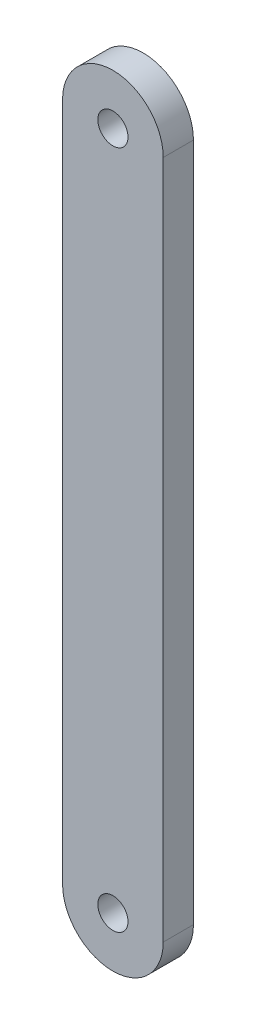
ISO-10303-21;
HEADER;
FILE_DESCRIPTION(('STEP AP214'),'2;1');
FILE_NAME('part.step','',(''),(''),'','','');
FILE_SCHEMA(('AUTOMOTIVE_DESIGN { 1 0 10303 214 1 1 1 1 }'));
ENDSEC;
DATA;
#1=APPLICATION_CONTEXT('core data for automotive mechanical design processes');
#2=APPLICATION_PROTOCOL_DEFINITION('international standard','automotive_design',2000,#1);
#3=PRODUCT_CONTEXT('',#1,'mechanical');
#4=PRODUCT('Part','Part','',(#3));
#5=PRODUCT_RELATED_PRODUCT_CATEGORY('part','',(#4));
#6=PRODUCT_DEFINITION_FORMATION('','',#4);
#7=PRODUCT_DEFINITION_CONTEXT('part definition',#1,'design');
#8=PRODUCT_DEFINITION('design','',#6,#7);
#9=PRODUCT_DEFINITION_SHAPE('','',#8);
#10=(LENGTH_UNIT() NAMED_UNIT(*) SI_UNIT(.MILLI.,.METRE.));
#11=(NAMED_UNIT(*) PLANE_ANGLE_UNIT() SI_UNIT($,.RADIAN.));
#12=(NAMED_UNIT(*) SI_UNIT($,.STERADIAN.) SOLID_ANGLE_UNIT());
#13=UNCERTAINTY_MEASURE_WITH_UNIT(LENGTH_MEASURE(1.E-05),#10,'distance_accuracy_value','');
#14=(GEOMETRIC_REPRESENTATION_CONTEXT(3) GLOBAL_UNCERTAINTY_ASSIGNED_CONTEXT((#13)) GLOBAL_UNIT_ASSIGNED_CONTEXT((#10,
#11,#12)) REPRESENTATION_CONTEXT('',''));
#15=CARTESIAN_POINT('',(0.,0.,0.));
#16=DIRECTION('',(0.,0.,1.));
#17=DIRECTION('',(1.,0.,0.));
#18=AXIS2_PLACEMENT_3D('',#15,#16,#17);
#19=CARTESIAN_POINT('',(5.,0.,3.));
#20=DIRECTION('',(1.,0.,0.));
#21=DIRECTION('',(0.,1.,0.));
#22=AXIS2_PLACEMENT_3D('',#19,#20,#21);
#23=PLANE('',#22);
#24=DIRECTION('',(0.,-1.,0.));
#25=VECTOR('',#24,1.);
#26=CARTESIAN_POINT('',(5.,0.,0.));
#27=LINE('',#26,#25);
#28=CARTESIAN_POINT('',(5.00000000000001,67.5,0.));
#29=VERTEX_POINT('',#28);
#30=CARTESIAN_POINT('',(5.,0.,0.));
#31=VERTEX_POINT('',#30);
#32=EDGE_CURVE('E120',#29,#31,#27,.T.);
#33=ORIENTED_EDGE('',*,*,#32,.F.);
#34=DIRECTION('',(0.,0.,-1.));
#35=VECTOR('',#34,1.);
#36=CARTESIAN_POINT('',(5.00000000000001,67.5,3.));
#37=LINE('',#36,#35);
#38=CARTESIAN_POINT('',(5.00000000000001,67.5,3.));
#39=VERTEX_POINT('',#38);
#40=EDGE_CURVE('E11',#39,#29,#37,.T.);
#41=ORIENTED_EDGE('',*,*,#40,.F.);
#42=DIRECTION('',(0.,-1.,0.));
#43=VECTOR('',#42,1.);
#44=CARTESIAN_POINT('',(5.,0.,3.));
#45=LINE('',#44,#43);
#46=CARTESIAN_POINT('',(5.,0.,3.));
#47=VERTEX_POINT('',#46);
#48=EDGE_CURVE('E93',#39,#47,#45,.T.);
#49=ORIENTED_EDGE('',*,*,#48,.T.);
#50=DIRECTION('',(0.,0.,-1.));
#51=VECTOR('',#50,1.);
#52=CARTESIAN_POINT('',(5.,0.,3.));
#53=LINE('',#52,#51);
#54=EDGE_CURVE('E82',#47,#31,#53,.T.);
#55=ORIENTED_EDGE('',*,*,#54,.T.);
#56=EDGE_LOOP('',(#33,#41,#49,#55));
#57=FACE_BOUND('',#56,.T.);
#58=ADVANCED_FACE('F43',(#57),#23,.T.);
#59=CARTESIAN_POINT('',(0.,67.5,3.));
#60=DIRECTION('',(0.,0.,-1.));
#61=DIRECTION('',(-1.,0.,0.));
#62=AXIS2_PLACEMENT_3D('',#59,#60,#61);
#63=CYLINDRICAL_SURFACE('',#62,5.);
#64=CARTESIAN_POINT('',(0.,67.5,0.));
#65=DIRECTION('',(0.,0.,1.));
#66=DIRECTION('',(1.,0.,0.));
#67=AXIS2_PLACEMENT_3D('',#64,#65,#66);
#68=CIRCLE('',#67,5.);
#69=CARTESIAN_POINT('',(-5.,67.5,0.));
#70=VERTEX_POINT('',#69);
#71=EDGE_CURVE('E100',#29,#70,#68,.T.);
#72=ORIENTED_EDGE('',*,*,#71,.T.);
#73=DIRECTION('',(0.,0.,-1.));
#74=VECTOR('',#73,1.);
#75=CARTESIAN_POINT('',(-5.,67.5,3.));
#76=LINE('',#75,#74);
#77=CARTESIAN_POINT('',(-5.,67.5,3.));
#78=VERTEX_POINT('',#77);
#79=EDGE_CURVE('E52',#78,#70,#76,.T.);
#80=ORIENTED_EDGE('',*,*,#79,.F.);
#81=CARTESIAN_POINT('',(0.,67.5,3.));
#82=DIRECTION('',(0.,0.,1.));
#83=DIRECTION('',(1.,0.,0.));
#84=AXIS2_PLACEMENT_3D('',#81,#82,#83);
#85=CIRCLE('',#84,5.);
#86=EDGE_CURVE('E87',#39,#78,#85,.T.);
#87=ORIENTED_EDGE('',*,*,#86,.F.);
#88=ORIENTED_EDGE('',*,*,#40,.T.);
#89=EDGE_LOOP('',(#72,#80,#87,#88));
#90=FACE_BOUND('',#89,.T.);
#91=ADVANCED_FACE('F98',(#90),#63,.T.);
#92=CARTESIAN_POINT('',(-5.,0.,3.));
#93=DIRECTION('',(-1.,0.,0.));
#94=DIRECTION('',(0.,-1.,0.));
#95=AXIS2_PLACEMENT_3D('',#92,#93,#94);
#96=PLANE('',#95);
#97=DIRECTION('',(0.,1.,0.));
#98=VECTOR('',#97,1.);
#99=CARTESIAN_POINT('',(-5.,0.,0.));
#100=LINE('',#99,#98);
#101=CARTESIAN_POINT('',(-5.,0.,0.));
#102=VERTEX_POINT('',#101);
#103=EDGE_CURVE('E126',#102,#70,#100,.T.);
#104=ORIENTED_EDGE('',*,*,#103,.F.);
#105=DIRECTION('',(0.,0.,-1.));
#106=VECTOR('',#105,1.);
#107=CARTESIAN_POINT('',(-5.,0.,3.));
#108=LINE('',#107,#106);
#109=CARTESIAN_POINT('',(-5.,0.,3.));
#110=VERTEX_POINT('',#109);
#111=EDGE_CURVE('E75',#110,#102,#108,.T.);
#112=ORIENTED_EDGE('',*,*,#111,.F.);
#113=DIRECTION('',(0.,1.,0.));
#114=VECTOR('',#113,1.);
#115=CARTESIAN_POINT('',(-5.,0.,3.));
#116=LINE('',#115,#114);
#117=EDGE_CURVE('E92',#110,#78,#116,.T.);
#118=ORIENTED_EDGE('',*,*,#117,.T.);
#119=ORIENTED_EDGE('',*,*,#79,.T.);
#120=EDGE_LOOP('',(#104,#112,#118,#119));
#121=FACE_BOUND('',#120,.T.);
#122=ADVANCED_FACE('F105',(#121),#96,.T.);
#123=CARTESIAN_POINT('',(0.,0.,3.));
#124=DIRECTION('',(0.,0.,-1.));
#125=DIRECTION('',(-1.,0.,0.));
#126=AXIS2_PLACEMENT_3D('',#123,#124,#125);
#127=CYLINDRICAL_SURFACE('',#126,1.5);
#128=CARTESIAN_POINT('',(0.,0.,3.));
#129=DIRECTION('',(0.,0.,1.));
#130=DIRECTION('',(1.,0.,0.));
#131=AXIS2_PLACEMENT_3D('',#128,#129,#130);
#132=CIRCLE('',#131,1.5);
#133=CARTESIAN_POINT('',(1.5,0.,3.));
#134=VERTEX_POINT('',#133);
#135=EDGE_CURVE('E109',#134,#134,#132,.T.);
#136=ORIENTED_EDGE('',*,*,#135,.T.);
#137=EDGE_LOOP('',(#136));
#138=FACE_BOUND('',#137,.T.);
#139=CARTESIAN_POINT('',(0.,0.,0.));
#140=DIRECTION('',(0.,0.,1.));
#141=DIRECTION('',(1.,0.,0.));
#142=AXIS2_PLACEMENT_3D('',#139,#140,#141);
#143=CIRCLE('',#142,1.5);
#144=CARTESIAN_POINT('',(1.5,0.,0.));
#145=VERTEX_POINT('',#144);
#146=EDGE_CURVE('E132',#145,#145,#143,.T.);
#147=ORIENTED_EDGE('',*,*,#146,.F.);
#148=EDGE_LOOP('',(#147));
#149=FACE_BOUND('',#148,.T.);
#150=ADVANCED_FACE('F153',(#138,#149),#127,.F.);
#151=CARTESIAN_POINT('',(0.,0.,3.));
#152=DIRECTION('',(0.,0.,-1.));
#153=DIRECTION('',(-1.,0.,0.));
#154=AXIS2_PLACEMENT_3D('',#151,#152,#153);
#155=CYLINDRICAL_SURFACE('',#154,5.);
#156=CARTESIAN_POINT('',(0.,0.,0.));
#157=DIRECTION('',(0.,0.,1.));
#158=DIRECTION('',(1.,0.,0.));
#159=AXIS2_PLACEMENT_3D('',#156,#157,#158);
#160=CIRCLE('',#159,5.);
#161=EDGE_CURVE('E129',#102,#31,#160,.T.);
#162=ORIENTED_EDGE('',*,*,#161,.T.);
#163=ORIENTED_EDGE('',*,*,#54,.F.);
#164=CARTESIAN_POINT('',(0.,0.,3.));
#165=DIRECTION('',(0.,0.,1.));
#166=DIRECTION('',(1.,0.,0.));
#167=AXIS2_PLACEMENT_3D('',#164,#165,#166);
#168=CIRCLE('',#167,5.);
#169=EDGE_CURVE('E60',#110,#47,#168,.T.);
#170=ORIENTED_EDGE('',*,*,#169,.F.);
#171=ORIENTED_EDGE('',*,*,#111,.T.);
#172=EDGE_LOOP('',(#162,#163,#170,#171));
#173=FACE_BOUND('',#172,.T.);
#174=ADVANCED_FACE('F156',(#173),#155,.T.);
#175=CARTESIAN_POINT('',(0.,67.5,3.));
#176=DIRECTION('',(0.,0.,-1.));
#177=DIRECTION('',(-1.,0.,0.));
#178=AXIS2_PLACEMENT_3D('',#175,#176,#177);
#179=CYLINDRICAL_SURFACE('',#178,1.5);
#180=CARTESIAN_POINT('',(0.,67.5,3.));
#181=DIRECTION('',(0.,0.,1.));
#182=DIRECTION('',(1.,0.,0.));
#183=AXIS2_PLACEMENT_3D('',#180,#181,#182);
#184=CIRCLE('',#183,1.5);
#185=CARTESIAN_POINT('',(1.5,67.5,3.));
#186=VERTEX_POINT('',#185);
#187=EDGE_CURVE('E116',#186,#186,#184,.T.);
#188=ORIENTED_EDGE('',*,*,#187,.T.);
#189=EDGE_LOOP('',(#188));
#190=FACE_BOUND('',#189,.T.);
#191=CARTESIAN_POINT('',(0.,67.5,0.));
#192=DIRECTION('',(0.,0.,1.));
#193=DIRECTION('',(1.,0.,0.));
#194=AXIS2_PLACEMENT_3D('',#191,#192,#193);
#195=CIRCLE('',#194,1.5);
#196=CARTESIAN_POINT('',(1.5,67.5,0.));
#197=VERTEX_POINT('',#196);
#198=EDGE_CURVE('E136',#197,#197,#195,.T.);
#199=ORIENTED_EDGE('',*,*,#198,.F.);
#200=EDGE_LOOP('',(#199));
#201=FACE_BOUND('',#200,.T.);
#202=ADVANCED_FACE('F159',(#190,#201),#179,.F.);
#203=CARTESIAN_POINT('',(0.,0.,3.));
#204=DIRECTION('',(0.,0.,1.));
#205=DIRECTION('',(1.,0.,0.));
#206=AXIS2_PLACEMENT_3D('',#203,#204,#205);
#207=PLANE('',#206);
#208=ORIENTED_EDGE('',*,*,#48,.F.);
#209=ORIENTED_EDGE('',*,*,#86,.T.);
#210=ORIENTED_EDGE('',*,*,#117,.F.);
#211=ORIENTED_EDGE('',*,*,#169,.T.);
#212=EDGE_LOOP('',(#208,#209,#210,#211));
#213=FACE_BOUND('',#212,.T.);
#214=ORIENTED_EDGE('',*,*,#135,.F.);
#215=EDGE_LOOP('',(#214));
#216=FACE_BOUND('',#215,.T.);
#217=ORIENTED_EDGE('',*,*,#187,.F.);
#218=EDGE_LOOP('',(#217));
#219=FACE_BOUND('',#218,.T.);
#220=ADVANCED_FACE('F89',(#213,#216,#219),#207,.T.);
#221=CARTESIAN_POINT('',(0.,0.,0.));
#222=DIRECTION('',(0.,0.,1.));
#223=DIRECTION('',(1.,0.,0.));
#224=AXIS2_PLACEMENT_3D('',#221,#222,#223);
#225=PLANE('',#224);
#226=ORIENTED_EDGE('',*,*,#32,.T.);
#227=ORIENTED_EDGE('',*,*,#161,.F.);
#228=ORIENTED_EDGE('',*,*,#103,.T.);
#229=ORIENTED_EDGE('',*,*,#71,.F.);
#230=EDGE_LOOP('',(#226,#227,#228,#229));
#231=FACE_BOUND('',#230,.T.);
#232=ORIENTED_EDGE('',*,*,#146,.T.);
#233=EDGE_LOOP('',(#232));
#234=FACE_BOUND('',#233,.T.);
#235=ORIENTED_EDGE('',*,*,#198,.T.);
#236=EDGE_LOOP('',(#235));
#237=FACE_BOUND('',#236,.T.);
#238=ADVANCED_FACE('F166',(#231,#234,#237),#225,.F.);
#239=CLOSED_SHELL('',(#58,#91,#122,#150,#174,#202,#220,#238));
#240=MANIFOLD_SOLID_BREP('B2',#239);
#241=ADVANCED_BREP_SHAPE_REPRESENTATION('',(#18,#240),#14);
#242=SHAPE_DEFINITION_REPRESENTATION(#9,#241);
ENDSEC;
END-ISO-10303-21;
